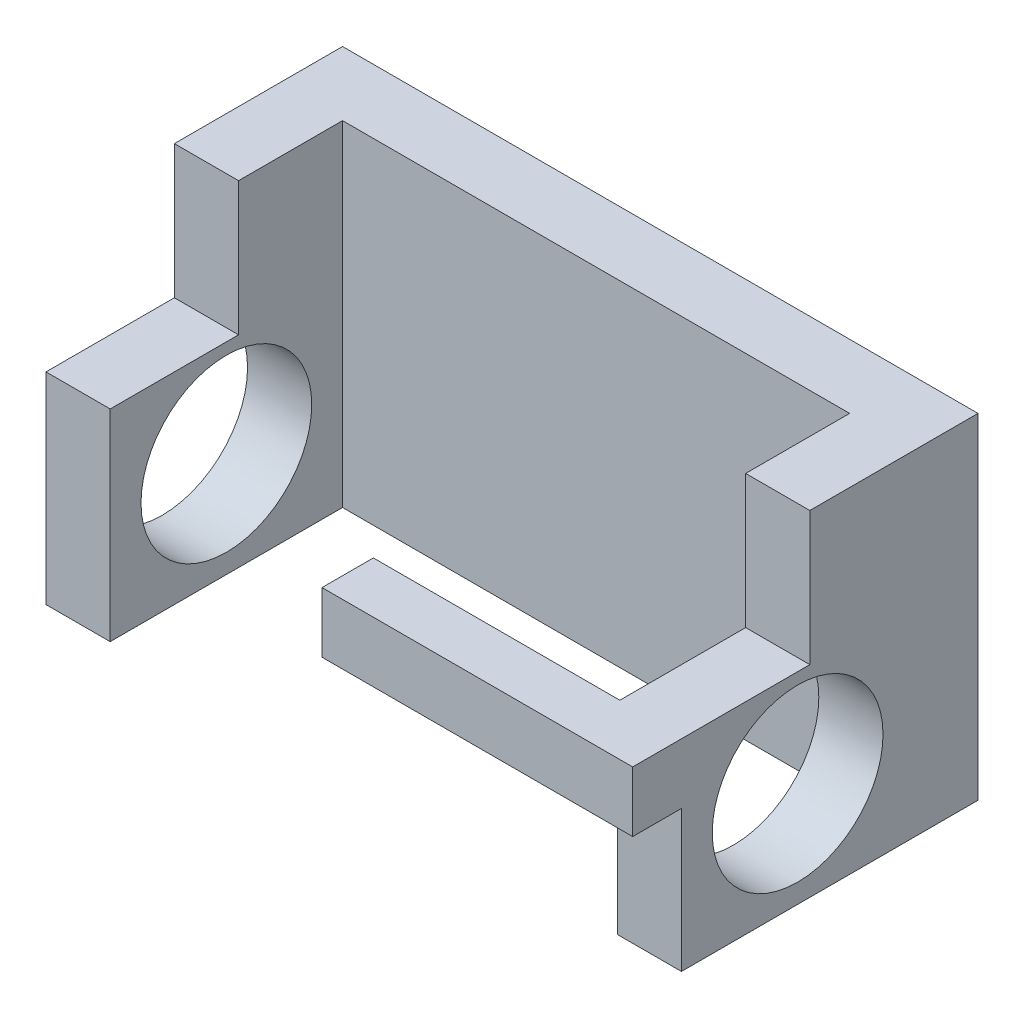
ISO-10303-21;
HEADER;
FILE_DESCRIPTION(('STEP AP214'),'2;1');
FILE_NAME('part.step','',(''),(''),'','','');
FILE_SCHEMA(('AUTOMOTIVE_DESIGN { 1 0 10303 214 1 1 1 1 }'));
ENDSEC;
DATA;
#1=APPLICATION_CONTEXT('core data for automotive mechanical design processes');
#2=APPLICATION_PROTOCOL_DEFINITION('international standard','automotive_design',2000,#1);
#3=PRODUCT_CONTEXT('',#1,'mechanical');
#4=PRODUCT('Part','Part','',(#3));
#5=PRODUCT_RELATED_PRODUCT_CATEGORY('part','',(#4));
#6=PRODUCT_DEFINITION_FORMATION('','',#4);
#7=PRODUCT_DEFINITION_CONTEXT('part definition',#1,'design');
#8=PRODUCT_DEFINITION('design','',#6,#7);
#9=PRODUCT_DEFINITION_SHAPE('','',#8);
#10=(LENGTH_UNIT() NAMED_UNIT(*) SI_UNIT(.MILLI.,.METRE.));
#11=(NAMED_UNIT(*) PLANE_ANGLE_UNIT() SI_UNIT($,.RADIAN.));
#12=(NAMED_UNIT(*) SI_UNIT($,.STERADIAN.) SOLID_ANGLE_UNIT());
#13=UNCERTAINTY_MEASURE_WITH_UNIT(LENGTH_MEASURE(1.E-05),#10,'distance_accuracy_value','');
#14=(GEOMETRIC_REPRESENTATION_CONTEXT(3) GLOBAL_UNCERTAINTY_ASSIGNED_CONTEXT((#13)) GLOBAL_UNIT_ASSIGNED_CONTEXT((#10,
#11,#12)) REPRESENTATION_CONTEXT('',''));
#15=CARTESIAN_POINT('',(0.,0.,0.));
#16=DIRECTION('',(0.,0.,1.));
#17=DIRECTION('',(1.,0.,0.));
#18=AXIS2_PLACEMENT_3D('',#15,#16,#17);
#19=CARTESIAN_POINT('',(-49.501,15.7,23.1));
#20=DIRECTION('',(0.,0.,-1.));
#21=DIRECTION('',(-1.,0.,0.));
#22=AXIS2_PLACEMENT_3D('',#19,#20,#21);
#23=PLANE('',#22);
#24=DIRECTION('',(-1.,0.,0.));
#25=VECTOR('',#24,1.);
#26=CARTESIAN_POINT('',(6.04400529450463,11.,23.1));
#27=LINE('',#26,#25);
#28=CARTESIAN_POINT('',(0.,11.,23.1));
#29=VERTEX_POINT('',#28);
#30=CARTESIAN_POINT('',(-5.,11.,23.1));
#31=VERTEX_POINT('',#30);
#32=EDGE_CURVE('E174',#29,#31,#27,.T.);
#33=ORIENTED_EDGE('',*,*,#32,.T.);
#34=DIRECTION('',(0.,-1.,0.));
#35=VECTOR('',#34,1.);
#36=CARTESIAN_POINT('',(-5.,15.7,23.1));
#37=LINE('',#36,#35);
#38=CARTESIAN_POINT('',(-5.,0.,23.1));
#39=VERTEX_POINT('',#38);
#40=EDGE_CURVE('E320',#31,#39,#37,.T.);
#41=ORIENTED_EDGE('',*,*,#40,.T.);
#42=DIRECTION('',(1.,0.,0.));
#43=VECTOR('',#42,1.);
#44=CARTESIAN_POINT('',(-49.501,0.,23.1));
#45=LINE('',#44,#43);
#46=CARTESIAN_POINT('',(0.,0.,23.1));
#47=VERTEX_POINT('',#46);
#48=EDGE_CURVE('E308',#39,#47,#45,.T.);
#49=ORIENTED_EDGE('',*,*,#48,.T.);
#50=DIRECTION('',(0.,1.,0.));
#51=VECTOR('',#50,1.);
#52=CARTESIAN_POINT('',(0.,15.7,23.1));
#53=LINE('',#52,#51);
#54=EDGE_CURVE('E307',#47,#29,#53,.T.);
#55=ORIENTED_EDGE('',*,*,#54,.T.);
#56=EDGE_LOOP('',(#33,#41,#49,#55));
#57=FACE_BOUND('',#56,.T.);
#58=ADVANCED_FACE('F39',(#57),#23,.F.);
#59=CARTESIAN_POINT('',(-5.,-45.1648093099041,21.9));
#60=DIRECTION('',(1.,0.,0.));
#61=DIRECTION('',(0.,0.,-1.));
#62=AXIS2_PLACEMENT_3D('',#59,#60,#61);
#63=PLANE('',#62);
#64=CARTESIAN_POINT('',(-5.,8.15,14.05));
#65=DIRECTION('',(1.,0.,0.));
#66=DIRECTION('',(0.,0.,-1.));
#67=AXIS2_PLACEMENT_3D('',#64,#65,#66);
#68=CIRCLE('',#67,6.65);
#69=CARTESIAN_POINT('',(-5.,8.15,7.4));
#70=VERTEX_POINT('',#69);
#71=EDGE_CURVE('E199',#70,#70,#68,.F.);
#72=ORIENTED_EDGE('',*,*,#71,.F.);
#73=EDGE_LOOP('',(#72));
#74=FACE_BOUND('',#73,.T.);
#75=DIRECTION('',(0.,-1.,0.));
#76=VECTOR('',#75,1.);
#77=CARTESIAN_POINT('',(-5.,15.7,22.9));
#78=LINE('',#77,#76);
#79=CARTESIAN_POINT('',(-5.,15.7,22.9));
#80=VERTEX_POINT('',#79);
#81=CARTESIAN_POINT('',(-5.,11.,22.9));
#82=VERTEX_POINT('',#81);
#83=EDGE_CURVE('E327',#80,#82,#78,.T.);
#84=ORIENTED_EDGE('',*,*,#83,.F.);
#85=DIRECTION('',(0.,0.,1.));
#86=VECTOR('',#85,1.);
#87=CARTESIAN_POINT('',(-5.,15.7,26.9));
#88=LINE('',#87,#86);
#89=CARTESIAN_POINT('',(-5.,15.7,13.1));
#90=VERTEX_POINT('',#89);
#91=EDGE_CURVE('E224',#90,#80,#88,.T.);
#92=ORIENTED_EDGE('',*,*,#91,.F.);
#93=DIRECTION('',(0.,-1.,0.));
#94=VECTOR('',#93,1.);
#95=CARTESIAN_POINT('',(-5.,15.7,13.1));
#96=LINE('',#95,#94);
#97=CARTESIAN_POINT('',(-5.,26.1,13.1));
#98=VERTEX_POINT('',#97);
#99=EDGE_CURVE('E63',#98,#90,#96,.T.);
#100=ORIENTED_EDGE('',*,*,#99,.F.);
#101=DIRECTION('',(0.,0.,-1.));
#102=VECTOR('',#101,1.);
#103=CARTESIAN_POINT('',(-5.,26.1,21.9));
#104=LINE('',#103,#102);
#105=CARTESIAN_POINT('',(-5.,26.1,5.));
#106=VERTEX_POINT('',#105);
#107=EDGE_CURVE('E230',#98,#106,#104,.T.);
#108=ORIENTED_EDGE('',*,*,#107,.T.);
#109=DIRECTION('',(0.,1.,0.));
#110=VECTOR('',#109,1.);
#111=CARTESIAN_POINT('',(-5.,-45.1648093099041,5.));
#112=LINE('',#111,#110);
#113=CARTESIAN_POINT('',(-5.,0.,5.));
#114=VERTEX_POINT('',#113);
#115=EDGE_CURVE('E251',#114,#106,#112,.T.);
#116=ORIENTED_EDGE('',*,*,#115,.F.);
#117=DIRECTION('',(0.,0.,-1.));
#118=VECTOR('',#117,1.);
#119=CARTESIAN_POINT('',(-5.,0.,21.9));
#120=LINE('',#119,#118);
#121=EDGE_CURVE('E235',#39,#114,#120,.T.);
#122=ORIENTED_EDGE('',*,*,#121,.F.);
#123=ORIENTED_EDGE('',*,*,#40,.F.);
#124=DIRECTION('',(0.,0.,1.));
#125=VECTOR('',#124,1.);
#126=CARTESIAN_POINT('',(-5.,11.,22.9));
#127=LINE('',#126,#125);
#128=EDGE_CURVE('E354',#82,#31,#127,.T.);
#129=ORIENTED_EDGE('',*,*,#128,.F.);
#130=EDGE_LOOP('',(#84,#92,#100,#108,#116,#122,#123,#129));
#131=FACE_BOUND('',#130,.T.);
#132=ADVANCED_FACE('F318',(#74,#131),#63,.F.);
#133=CARTESIAN_POINT('',(0.,26.1,0.));
#134=DIRECTION('',(-1.,0.,0.));
#135=DIRECTION('',(0.,0.,1.));
#136=AXIS2_PLACEMENT_3D('',#133,#134,#135);
#137=PLANE('',#136);
#138=CARTESIAN_POINT('',(0.,8.15,14.05));
#139=DIRECTION('',(1.,0.,0.));
#140=DIRECTION('',(0.,0.,-1.));
#141=AXIS2_PLACEMENT_3D('',#138,#139,#140);
#142=CIRCLE('',#141,6.65);
#143=CARTESIAN_POINT('',(0.,8.15,7.4));
#144=VERTEX_POINT('',#143);
#145=EDGE_CURVE('E194',#144,#144,#142,.T.);
#146=ORIENTED_EDGE('',*,*,#145,.F.);
#147=EDGE_LOOP('',(#146));
#148=FACE_BOUND('',#147,.T.);
#149=DIRECTION('',(0.,0.,-1.));
#150=VECTOR('',#149,1.);
#151=CARTESIAN_POINT('',(0.,15.7,26.9));
#152=LINE('',#151,#150);
#153=CARTESIAN_POINT('',(0.,15.7,26.9));
#154=VERTEX_POINT('',#153);
#155=CARTESIAN_POINT('',(0.,15.7,13.1));
#156=VERTEX_POINT('',#155);
#157=EDGE_CURVE('E213',#154,#156,#152,.T.);
#158=ORIENTED_EDGE('',*,*,#157,.F.);
#159=DIRECTION('',(0.,1.,0.));
#160=VECTOR('',#159,1.);
#161=CARTESIAN_POINT('',(0.,15.7,26.9));
#162=LINE('',#161,#160);
#163=CARTESIAN_POINT('',(0.,11.,26.9));
#164=VERTEX_POINT('',#163);
#165=EDGE_CURVE('E336',#164,#154,#162,.T.);
#166=ORIENTED_EDGE('',*,*,#165,.F.);
#167=DIRECTION('',(0.,0.,1.));
#168=VECTOR('',#167,1.);
#169=CARTESIAN_POINT('',(0.,11.,26.9));
#170=LINE('',#169,#168);
#171=EDGE_CURVE('E350',#29,#164,#170,.T.);
#172=ORIENTED_EDGE('',*,*,#171,.F.);
#173=ORIENTED_EDGE('',*,*,#54,.F.);
#174=DIRECTION('',(0.,0.,-1.));
#175=VECTOR('',#174,1.);
#176=CARTESIAN_POINT('',(0.,0.,0.));
#177=LINE('',#176,#175);
#178=CARTESIAN_POINT('',(0.,0.,0.));
#179=VERTEX_POINT('',#178);
#180=EDGE_CURVE('E245',#47,#179,#177,.T.);
#181=ORIENTED_EDGE('',*,*,#180,.T.);
#182=DIRECTION('',(0.,-1.,0.));
#183=VECTOR('',#182,1.);
#184=CARTESIAN_POINT('',(0.,26.1,0.));
#185=LINE('',#184,#183);
#186=CARTESIAN_POINT('',(0.,26.1,0.));
#187=VERTEX_POINT('',#186);
#188=EDGE_CURVE('E11',#187,#179,#185,.T.);
#189=ORIENTED_EDGE('',*,*,#188,.F.);
#190=DIRECTION('',(0.,0.,-1.));
#191=VECTOR('',#190,1.);
#192=CARTESIAN_POINT('',(0.,26.1,0.));
#193=LINE('',#192,#191);
#194=CARTESIAN_POINT('',(0.,26.1,13.1));
#195=VERTEX_POINT('',#194);
#196=EDGE_CURVE('E259',#195,#187,#193,.T.);
#197=ORIENTED_EDGE('',*,*,#196,.F.);
#198=DIRECTION('',(0.,1.,0.));
#199=VECTOR('',#198,1.);
#200=CARTESIAN_POINT('',(0.,15.7,13.1));
#201=LINE('',#200,#199);
#202=EDGE_CURVE('E216',#156,#195,#201,.T.);
#203=ORIENTED_EDGE('',*,*,#202,.F.);
#204=EDGE_LOOP('',(#158,#166,#172,#173,#181,#189,#197,#203));
#205=FACE_BOUND('',#204,.T.);
#206=ADVANCED_FACE('F41',(#148,#205),#137,.F.);
#207=CARTESIAN_POINT('',(0.,26.1,0.));
#208=DIRECTION('',(0.,0.,1.));
#209=DIRECTION('',(1.,0.,0.));
#210=AXIS2_PLACEMENT_3D('',#207,#208,#209);
#211=PLANE('',#210);
#212=DIRECTION('',(-1.,0.,0.));
#213=VECTOR('',#212,1.);
#214=CARTESIAN_POINT('',(0.,0.,0.));
#215=LINE('',#214,#213);
#216=CARTESIAN_POINT('',(-49.5,0.,0.));
#217=VERTEX_POINT('',#216);
#218=EDGE_CURVE('E271',#179,#217,#215,.T.);
#219=ORIENTED_EDGE('',*,*,#218,.T.);
#220=DIRECTION('',(0.,-1.,0.));
#221=VECTOR('',#220,1.);
#222=CARTESIAN_POINT('',(-49.5,26.1,0.));
#223=LINE('',#222,#221);
#224=CARTESIAN_POINT('',(-49.5,26.1,0.));
#225=VERTEX_POINT('',#224);
#226=EDGE_CURVE('E48',#225,#217,#223,.T.);
#227=ORIENTED_EDGE('',*,*,#226,.F.);
#228=DIRECTION('',(-1.,0.,0.));
#229=VECTOR('',#228,1.);
#230=CARTESIAN_POINT('',(0.,26.1,0.));
#231=LINE('',#230,#229);
#232=EDGE_CURVE('E262',#187,#225,#231,.T.);
#233=ORIENTED_EDGE('',*,*,#232,.F.);
#234=ORIENTED_EDGE('',*,*,#188,.T.);
#235=EDGE_LOOP('',(#219,#227,#233,#234));
#236=FACE_BOUND('',#235,.T.);
#237=ADVANCED_FACE('F302',(#236),#211,.F.);
#238=CARTESIAN_POINT('',(-49.5,26.1,0.));
#239=DIRECTION('',(1.,0.,0.));
#240=DIRECTION('',(0.,0.,-1.));
#241=AXIS2_PLACEMENT_3D('',#238,#239,#240);
#242=PLANE('',#241);
#243=CARTESIAN_POINT('',(-49.5,8.15,14.0500000000007));
#244=DIRECTION('',(1.,0.,0.));
#245=DIRECTION('',(0.,0.,-1.));
#246=AXIS2_PLACEMENT_3D('',#243,#244,#245);
#247=CIRCLE('',#246,6.65);
#248=CARTESIAN_POINT('',(-49.5,8.15,7.40000000000069));
#249=VERTEX_POINT('',#248);
#250=EDGE_CURVE('E207',#249,#249,#247,.F.);
#251=ORIENTED_EDGE('',*,*,#250,.F.);
#252=EDGE_LOOP('',(#251));
#253=FACE_BOUND('',#252,.T.);
#254=DIRECTION('',(0.,-1.,0.));
#255=VECTOR('',#254,1.);
#256=CARTESIAN_POINT('',(-49.5,0.,23.1));
#257=LINE('',#256,#255);
#258=CARTESIAN_POINT('',(-49.5,15.7,23.1));
#259=VERTEX_POINT('',#258);
#260=CARTESIAN_POINT('',(-49.5,0.,23.1));
#261=VERTEX_POINT('',#260);
#262=EDGE_CURVE('E55',#259,#261,#257,.T.);
#263=ORIENTED_EDGE('',*,*,#262,.F.);
#264=DIRECTION('',(0.,0.,1.));
#265=VECTOR('',#264,1.);
#266=CARTESIAN_POINT('',(-49.5,15.7,13.1));
#267=LINE('',#266,#265);
#268=CARTESIAN_POINT('',(-49.5,15.7,13.1));
#269=VERTEX_POINT('',#268);
#270=EDGE_CURVE('E158',#269,#259,#267,.T.);
#271=ORIENTED_EDGE('',*,*,#270,.F.);
#272=DIRECTION('',(0.,1.,0.));
#273=VECTOR('',#272,1.);
#274=CARTESIAN_POINT('',(-49.5,15.7,13.1));
#275=LINE('',#274,#273);
#276=CARTESIAN_POINT('',(-49.5,26.1,13.1));
#277=VERTEX_POINT('',#276);
#278=EDGE_CURVE('E184',#269,#277,#275,.T.);
#279=ORIENTED_EDGE('',*,*,#278,.T.);
#280=DIRECTION('',(0.,0.,1.));
#281=VECTOR('',#280,1.);
#282=CARTESIAN_POINT('',(-49.5,26.1,0.));
#283=LINE('',#282,#281);
#284=EDGE_CURVE('E265',#225,#277,#283,.T.);
#285=ORIENTED_EDGE('',*,*,#284,.F.);
#286=ORIENTED_EDGE('',*,*,#226,.T.);
#287=DIRECTION('',(0.,0.,1.));
#288=VECTOR('',#287,1.);
#289=CARTESIAN_POINT('',(-49.5,0.,0.));
#290=LINE('',#289,#288);
#291=EDGE_CURVE('E161',#217,#261,#290,.T.);
#292=ORIENTED_EDGE('',*,*,#291,.T.);
#293=EDGE_LOOP('',(#263,#271,#279,#285,#286,#292));
#294=FACE_BOUND('',#293,.T.);
#295=ADVANCED_FACE('F155',(#253,#294),#242,.F.);
#296=CARTESIAN_POINT('',(0.,26.1,0.));
#297=DIRECTION('',(0.,-1.,0.));
#298=DIRECTION('',(0.,0.,-1.));
#299=AXIS2_PLACEMENT_3D('',#296,#297,#298);
#300=PLANE('',#299);
#301=ORIENTED_EDGE('',*,*,#284,.T.);
#302=DIRECTION('',(-1.,0.,0.));
#303=VECTOR('',#302,1.);
#304=CARTESIAN_POINT('',(-44.5,26.1,13.1));
#305=LINE('',#304,#303);
#306=CARTESIAN_POINT('',(-44.5,26.1,13.1));
#307=VERTEX_POINT('',#306);
#308=EDGE_CURVE('E190',#307,#277,#305,.T.);
#309=ORIENTED_EDGE('',*,*,#308,.F.);
#310=DIRECTION('',(0.,0.,1.));
#311=VECTOR('',#310,1.);
#312=CARTESIAN_POINT('',(-44.5,26.1,21.9));
#313=LINE('',#312,#311);
#314=CARTESIAN_POINT('',(-44.5,26.1,5.00000000000001));
#315=VERTEX_POINT('',#314);
#316=EDGE_CURVE('E231',#315,#307,#313,.T.);
#317=ORIENTED_EDGE('',*,*,#316,.F.);
#318=DIRECTION('',(-1.,0.,0.));
#319=VECTOR('',#318,1.);
#320=CARTESIAN_POINT('',(-5.,26.1,5.));
#321=LINE('',#320,#319);
#322=EDGE_CURVE('E236',#106,#315,#321,.T.);
#323=ORIENTED_EDGE('',*,*,#322,.F.);
#324=ORIENTED_EDGE('',*,*,#107,.F.);
#325=DIRECTION('',(1.,0.,0.));
#326=VECTOR('',#325,1.);
#327=CARTESIAN_POINT('',(-49.501,26.1,13.1));
#328=LINE('',#327,#326);
#329=EDGE_CURVE('E220',#98,#195,#328,.T.);
#330=ORIENTED_EDGE('',*,*,#329,.T.);
#331=ORIENTED_EDGE('',*,*,#196,.T.);
#332=ORIENTED_EDGE('',*,*,#232,.T.);
#333=EDGE_LOOP('',(#301,#309,#317,#323,#324,#330,#331,#332));
#334=FACE_BOUND('',#333,.T.);
#335=ADVANCED_FACE('F298',(#334),#300,.F.);
#336=CARTESIAN_POINT('',(0.,0.,0.));
#337=DIRECTION('',(0.,-1.,0.));
#338=DIRECTION('',(0.,0.,-1.));
#339=AXIS2_PLACEMENT_3D('',#336,#337,#338);
#340=PLANE('',#339);
#341=ORIENTED_EDGE('',*,*,#48,.F.);
#342=ORIENTED_EDGE('',*,*,#121,.T.);
#343=DIRECTION('',(-1.,0.,0.));
#344=VECTOR('',#343,1.);
#345=CARTESIAN_POINT('',(-5.,0.,5.));
#346=LINE('',#345,#344);
#347=CARTESIAN_POINT('',(-44.5,0.,5.00000000000001));
#348=VERTEX_POINT('',#347);
#349=EDGE_CURVE('E247',#114,#348,#346,.T.);
#350=ORIENTED_EDGE('',*,*,#349,.T.);
#351=DIRECTION('',(0.,0.,1.));
#352=VECTOR('',#351,1.);
#353=CARTESIAN_POINT('',(-44.5,0.,21.9));
#354=LINE('',#353,#352);
#355=CARTESIAN_POINT('',(-44.5,0.,23.1));
#356=VERTEX_POINT('',#355);
#357=EDGE_CURVE('E242',#348,#356,#354,.T.);
#358=ORIENTED_EDGE('',*,*,#357,.T.);
#359=DIRECTION('',(1.,0.,0.));
#360=VECTOR('',#359,1.);
#361=CARTESIAN_POINT('',(-49.5,0.,23.1));
#362=LINE('',#361,#360);
#363=EDGE_CURVE('E163',#261,#356,#362,.T.);
#364=ORIENTED_EDGE('',*,*,#363,.F.);
#365=ORIENTED_EDGE('',*,*,#291,.F.);
#366=ORIENTED_EDGE('',*,*,#218,.F.);
#367=ORIENTED_EDGE('',*,*,#180,.F.);
#368=EDGE_LOOP('',(#341,#342,#350,#358,#364,#365,#366,#367));
#369=FACE_BOUND('',#368,.T.);
#370=ADVANCED_FACE('F283',(#369),#340,.T.);
#371=CARTESIAN_POINT('',(-5.,-45.1648093099041,5.));
#372=DIRECTION('',(0.,0.,-1.));
#373=DIRECTION('',(-1.,0.,0.));
#374=AXIS2_PLACEMENT_3D('',#371,#372,#373);
#375=PLANE('',#374);
#376=ORIENTED_EDGE('',*,*,#115,.T.);
#377=ORIENTED_EDGE('',*,*,#322,.T.);
#378=DIRECTION('',(0.,1.,0.));
#379=VECTOR('',#378,1.);
#380=CARTESIAN_POINT('',(-44.5,-45.1648093099041,5.00000000000001));
#381=LINE('',#380,#379);
#382=EDGE_CURVE('E246',#348,#315,#381,.T.);
#383=ORIENTED_EDGE('',*,*,#382,.F.);
#384=ORIENTED_EDGE('',*,*,#349,.F.);
#385=EDGE_LOOP('',(#376,#377,#383,#384));
#386=FACE_BOUND('',#385,.T.);
#387=ADVANCED_FACE('F323',(#386),#375,.F.);
#388=CARTESIAN_POINT('',(-44.5,-45.1648093099041,21.9));
#389=DIRECTION('',(-1.,0.,0.));
#390=DIRECTION('',(0.,0.,1.));
#391=AXIS2_PLACEMENT_3D('',#388,#389,#390);
#392=PLANE('',#391);
#393=DIRECTION('',(0.,0.,-1.));
#394=VECTOR('',#393,1.);
#395=CARTESIAN_POINT('',(-44.5,15.7,22.9));
#396=LINE('',#395,#394);
#397=CARTESIAN_POINT('',(-44.5,15.7,23.1));
#398=VERTEX_POINT('',#397);
#399=CARTESIAN_POINT('',(-44.5,15.7,13.1));
#400=VERTEX_POINT('',#399);
#401=EDGE_CURVE('E186',#398,#400,#396,.T.);
#402=ORIENTED_EDGE('',*,*,#401,.F.);
#403=DIRECTION('',(0.,-1.,0.));
#404=VECTOR('',#403,1.);
#405=CARTESIAN_POINT('',(-44.5,0.,23.1));
#406=LINE('',#405,#404);
#407=EDGE_CURVE('E164',#398,#356,#406,.T.);
#408=ORIENTED_EDGE('',*,*,#407,.T.);
#409=ORIENTED_EDGE('',*,*,#357,.F.);
#410=ORIENTED_EDGE('',*,*,#382,.T.);
#411=ORIENTED_EDGE('',*,*,#316,.T.);
#412=DIRECTION('',(0.,1.,0.));
#413=VECTOR('',#412,1.);
#414=CARTESIAN_POINT('',(-44.5,15.7,13.1));
#415=LINE('',#414,#413);
#416=EDGE_CURVE('E180',#400,#307,#415,.T.);
#417=ORIENTED_EDGE('',*,*,#416,.F.);
#418=EDGE_LOOP('',(#402,#408,#409,#410,#411,#417));
#419=FACE_BOUND('',#418,.T.);
#420=CARTESIAN_POINT('',(-44.5000000000001,8.15,14.0500000000006));
#421=DIRECTION('',(1.,0.,0.));
#422=DIRECTION('',(0.,0.,-1.));
#423=AXIS2_PLACEMENT_3D('',#420,#421,#422);
#424=CIRCLE('',#423,6.65);
#425=CARTESIAN_POINT('',(-44.5000000000002,8.15,7.40000000000062));
#426=VERTEX_POINT('',#425);
#427=EDGE_CURVE('E203',#426,#426,#424,.T.);
#428=ORIENTED_EDGE('',*,*,#427,.F.);
#429=EDGE_LOOP('',(#428));
#430=FACE_BOUND('',#429,.T.);
#431=ADVANCED_FACE('F291',(#419,#430),#392,.F.);
#432=CARTESIAN_POINT('',(-49.501,15.7,13.1));
#433=DIRECTION('',(0.,0.,-1.));
#434=DIRECTION('',(-1.,0.,0.));
#435=AXIS2_PLACEMENT_3D('',#432,#433,#434);
#436=PLANE('',#435);
#437=ORIENTED_EDGE('',*,*,#99,.T.);
#438=DIRECTION('',(1.,0.,0.));
#439=VECTOR('',#438,1.);
#440=CARTESIAN_POINT('',(-49.501,15.7,13.1));
#441=LINE('',#440,#439);
#442=EDGE_CURVE('E219',#90,#156,#441,.T.);
#443=ORIENTED_EDGE('',*,*,#442,.T.);
#444=ORIENTED_EDGE('',*,*,#202,.T.);
#445=ORIENTED_EDGE('',*,*,#329,.F.);
#446=EDGE_LOOP('',(#437,#443,#444,#445));
#447=FACE_BOUND('',#446,.T.);
#448=ADVANCED_FACE('F325',(#447),#436,.F.);
#449=CARTESIAN_POINT('',(-49.501,15.7,26.9));
#450=DIRECTION('',(0.,-1.,0.));
#451=DIRECTION('',(0.,0.,-1.));
#452=AXIS2_PLACEMENT_3D('',#449,#450,#451);
#453=PLANE('',#452);
#454=DIRECTION('',(1.,0.,0.));
#455=VECTOR('',#454,1.);
#456=CARTESIAN_POINT('',(-24.2,15.7,26.9));
#457=LINE('',#456,#455);
#458=CARTESIAN_POINT('',(-24.2,15.7,26.9));
#459=VERTEX_POINT('',#458);
#460=EDGE_CURVE('E339',#459,#154,#457,.T.);
#461=ORIENTED_EDGE('',*,*,#460,.T.);
#462=ORIENTED_EDGE('',*,*,#157,.T.);
#463=ORIENTED_EDGE('',*,*,#442,.F.);
#464=ORIENTED_EDGE('',*,*,#91,.T.);
#465=DIRECTION('',(1.,0.,0.));
#466=VECTOR('',#465,1.);
#467=CARTESIAN_POINT('',(-24.2,15.7,22.9));
#468=LINE('',#467,#466);
#469=CARTESIAN_POINT('',(-24.2,15.7,22.9));
#470=VERTEX_POINT('',#469);
#471=EDGE_CURVE('E332',#470,#80,#468,.T.);
#472=ORIENTED_EDGE('',*,*,#471,.F.);
#473=DIRECTION('',(0.,0.,-1.));
#474=VECTOR('',#473,1.);
#475=CARTESIAN_POINT('',(-24.2,15.7,26.9));
#476=LINE('',#475,#474);
#477=EDGE_CURVE('E340',#459,#470,#476,.T.);
#478=ORIENTED_EDGE('',*,*,#477,.F.);
#479=EDGE_LOOP('',(#461,#462,#463,#464,#472,#478));
#480=FACE_BOUND('',#479,.T.);
#481=ADVANCED_FACE('F331',(#480),#453,.F.);
#482=CARTESIAN_POINT('',(-49.5010000000002,8.15,14.0500000000007));
#483=DIRECTION('',(1.,0.,0.));
#484=DIRECTION('',(0.,0.,-1.));
#485=AXIS2_PLACEMENT_3D('',#482,#483,#484);
#486=CYLINDRICAL_SURFACE('',#485,6.65);
#487=ORIENTED_EDGE('',*,*,#427,.T.);
#488=EDGE_LOOP('',(#487));
#489=FACE_BOUND('',#488,.T.);
#490=ORIENTED_EDGE('',*,*,#250,.T.);
#491=EDGE_LOOP('',(#490));
#492=FACE_BOUND('',#491,.T.);
#493=ADVANCED_FACE('F420',(#489,#492),#486,.F.);
#494=CARTESIAN_POINT('',(-49.501,8.15,14.05));
#495=DIRECTION('',(1.,0.,0.));
#496=DIRECTION('',(0.,0.,-1.));
#497=AXIS2_PLACEMENT_3D('',#494,#495,#496);
#498=CYLINDRICAL_SURFACE('',#497,6.65);
#499=ORIENTED_EDGE('',*,*,#145,.T.);
#500=EDGE_LOOP('',(#499));
#501=FACE_BOUND('',#500,.T.);
#502=ORIENTED_EDGE('',*,*,#71,.T.);
#503=EDGE_LOOP('',(#502));
#504=FACE_BOUND('',#503,.T.);
#505=ADVANCED_FACE('F417',(#501,#504),#498,.F.);
#506=CARTESIAN_POINT('',(-44.5,15.7,13.1));
#507=DIRECTION('',(0.,0.,-1.));
#508=DIRECTION('',(-1.,0.,0.));
#509=AXIS2_PLACEMENT_3D('',#506,#507,#508);
#510=PLANE('',#509);
#511=ORIENTED_EDGE('',*,*,#308,.T.);
#512=ORIENTED_EDGE('',*,*,#278,.F.);
#513=DIRECTION('',(-1.,0.,0.));
#514=VECTOR('',#513,1.);
#515=CARTESIAN_POINT('',(-44.5,15.7,13.1));
#516=LINE('',#515,#514);
#517=EDGE_CURVE('E178',#400,#269,#516,.T.);
#518=ORIENTED_EDGE('',*,*,#517,.F.);
#519=ORIENTED_EDGE('',*,*,#416,.T.);
#520=EDGE_LOOP('',(#511,#512,#518,#519));
#521=FACE_BOUND('',#520,.T.);
#522=ADVANCED_FACE('F296',(#521),#510,.F.);
#523=CARTESIAN_POINT('',(0.,15.7,0.));
#524=DIRECTION('',(0.,1.,0.));
#525=DIRECTION('',(0.,0.,1.));
#526=AXIS2_PLACEMENT_3D('',#523,#524,#525);
#527=PLANE('',#526);
#528=DIRECTION('',(1.,0.,0.));
#529=VECTOR('',#528,1.);
#530=CARTESIAN_POINT('',(-49.5,15.7,23.1));
#531=LINE('',#530,#529);
#532=EDGE_CURVE('E168',#259,#398,#531,.T.);
#533=ORIENTED_EDGE('',*,*,#532,.T.);
#534=ORIENTED_EDGE('',*,*,#401,.T.);
#535=ORIENTED_EDGE('',*,*,#517,.T.);
#536=ORIENTED_EDGE('',*,*,#270,.T.);
#537=EDGE_LOOP('',(#533,#534,#535,#536));
#538=FACE_BOUND('',#537,.T.);
#539=ADVANCED_FACE('F177',(#538),#527,.T.);
#540=CARTESIAN_POINT('',(0.,0.,23.1));
#541=DIRECTION('',(0.,0.,-1.));
#542=DIRECTION('',(-1.,0.,0.));
#543=AXIS2_PLACEMENT_3D('',#540,#541,#542);
#544=PLANE('',#543);
#545=ORIENTED_EDGE('',*,*,#363,.T.);
#546=ORIENTED_EDGE('',*,*,#407,.F.);
#547=ORIENTED_EDGE('',*,*,#532,.F.);
#548=ORIENTED_EDGE('',*,*,#262,.T.);
#549=EDGE_LOOP('',(#545,#546,#547,#548));
#550=FACE_BOUND('',#549,.T.);
#551=ADVANCED_FACE('F169',(#550),#544,.F.);
#552=CARTESIAN_POINT('',(-24.2,11.,26.9));
#553=DIRECTION('',(0.,0.,-1.));
#554=DIRECTION('',(0.,1.,0.));
#555=AXIS2_PLACEMENT_3D('',#552,#553,#554);
#556=PLANE('',#555);
#557=DIRECTION('',(1.,0.,0.));
#558=VECTOR('',#557,1.);
#559=CARTESIAN_POINT('',(-24.2,11.,26.9));
#560=LINE('',#559,#558);
#561=CARTESIAN_POINT('',(-24.2,11.,26.9));
#562=VERTEX_POINT('',#561);
#563=EDGE_CURVE('E348',#562,#164,#560,.T.);
#564=ORIENTED_EDGE('',*,*,#563,.T.);
#565=ORIENTED_EDGE('',*,*,#165,.T.);
#566=ORIENTED_EDGE('',*,*,#460,.F.);
#567=DIRECTION('',(0.,1.,0.));
#568=VECTOR('',#567,1.);
#569=CARTESIAN_POINT('',(-24.2,11.,26.9));
#570=LINE('',#569,#568);
#571=EDGE_CURVE('E360',#562,#459,#570,.T.);
#572=ORIENTED_EDGE('',*,*,#571,.F.);
#573=EDGE_LOOP('',(#564,#565,#566,#572));
#574=FACE_BOUND('',#573,.T.);
#575=ADVANCED_FACE('F346',(#574),#556,.F.);
#576=CARTESIAN_POINT('',(-24.2,15.7,22.9));
#577=DIRECTION('',(0.,0.,1.));
#578=DIRECTION('',(1.,0.,0.));
#579=AXIS2_PLACEMENT_3D('',#576,#577,#578);
#580=PLANE('',#579);
#581=ORIENTED_EDGE('',*,*,#83,.T.);
#582=DIRECTION('',(1.,0.,0.));
#583=VECTOR('',#582,1.);
#584=CARTESIAN_POINT('',(-24.2,11.,22.9));
#585=LINE('',#584,#583);
#586=CARTESIAN_POINT('',(-24.2,11.,22.9));
#587=VERTEX_POINT('',#586);
#588=EDGE_CURVE('E376',#587,#82,#585,.T.);
#589=ORIENTED_EDGE('',*,*,#588,.F.);
#590=DIRECTION('',(0.,-1.,0.));
#591=VECTOR('',#590,1.);
#592=CARTESIAN_POINT('',(-24.2,15.7,22.9));
#593=LINE('',#592,#591);
#594=EDGE_CURVE('E365',#470,#587,#593,.T.);
#595=ORIENTED_EDGE('',*,*,#594,.F.);
#596=ORIENTED_EDGE('',*,*,#471,.T.);
#597=EDGE_LOOP('',(#581,#589,#595,#596));
#598=FACE_BOUND('',#597,.T.);
#599=ADVANCED_FACE('F392',(#598),#580,.F.);
#600=CARTESIAN_POINT('',(-24.2,11.,22.9));
#601=DIRECTION('',(0.,1.,0.));
#602=DIRECTION('',(0.,0.,1.));
#603=AXIS2_PLACEMENT_3D('',#600,#601,#602);
#604=PLANE('',#603);
#605=ORIENTED_EDGE('',*,*,#128,.T.);
#606=ORIENTED_EDGE('',*,*,#32,.F.);
#607=ORIENTED_EDGE('',*,*,#171,.T.);
#608=ORIENTED_EDGE('',*,*,#563,.F.);
#609=DIRECTION('',(0.,0.,1.));
#610=VECTOR('',#609,1.);
#611=CARTESIAN_POINT('',(-24.2,11.,22.9));
#612=LINE('',#611,#610);
#613=EDGE_CURVE('E368',#587,#562,#612,.T.);
#614=ORIENTED_EDGE('',*,*,#613,.F.);
#615=ORIENTED_EDGE('',*,*,#588,.T.);
#616=EDGE_LOOP('',(#605,#606,#607,#608,#614,#615));
#617=FACE_BOUND('',#616,.T.);
#618=ADVANCED_FACE('F388',(#617),#604,.F.);
#619=CARTESIAN_POINT('',(-24.2,0.,0.));
#620=DIRECTION('',(-1.,0.,0.));
#621=DIRECTION('',(0.,0.,1.));
#622=AXIS2_PLACEMENT_3D('',#619,#620,#621);
#623=PLANE('',#622);
#624=ORIENTED_EDGE('',*,*,#571,.T.);
#625=ORIENTED_EDGE('',*,*,#477,.T.);
#626=ORIENTED_EDGE('',*,*,#594,.T.);
#627=ORIENTED_EDGE('',*,*,#613,.T.);
#628=EDGE_LOOP('',(#624,#625,#626,#627));
#629=FACE_BOUND('',#628,.T.);
#630=ADVANCED_FACE('F394',(#629),#623,.T.);
#631=CLOSED_SHELL('',(#58,#132,#206,#237,#295,#335,#370,#387,#431,#448,#481,#493,#505,#522,#539,
#551,#575,#599,#618,#630));
#632=MANIFOLD_SOLID_BREP('B2',#631);
#633=ADVANCED_BREP_SHAPE_REPRESENTATION('',(#18,#632),#14);
#634=SHAPE_DEFINITION_REPRESENTATION(#9,#633);
ENDSEC;
END-ISO-10303-21;
